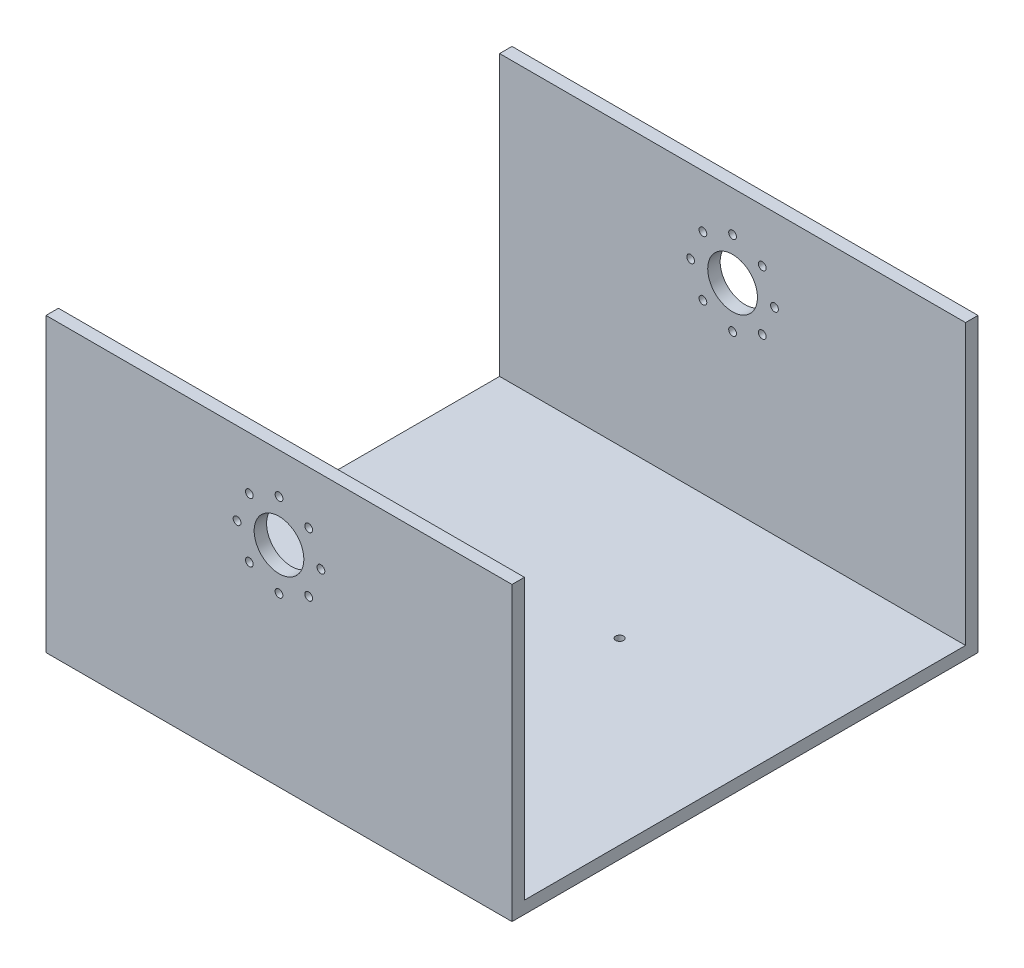
ISO-10303-21;
HEADER;
FILE_DESCRIPTION(('STEP AP214'),'2;1');
FILE_NAME('part.step','',(''),(''),'','','');
FILE_SCHEMA(('AUTOMOTIVE_DESIGN { 1 0 10303 214 1 1 1 1 }'));
ENDSEC;
DATA;
#1=APPLICATION_CONTEXT('core data for automotive mechanical design processes');
#2=APPLICATION_PROTOCOL_DEFINITION('international standard','automotive_design',2000,#1);
#3=PRODUCT_CONTEXT('',#1,'mechanical');
#4=PRODUCT('Part','Part','',(#3));
#5=PRODUCT_RELATED_PRODUCT_CATEGORY('part','',(#4));
#6=PRODUCT_DEFINITION_FORMATION('','',#4);
#7=PRODUCT_DEFINITION_CONTEXT('part definition',#1,'design');
#8=PRODUCT_DEFINITION('design','',#6,#7);
#9=PRODUCT_DEFINITION_SHAPE('','',#8);
#10=(LENGTH_UNIT() NAMED_UNIT(*) SI_UNIT(.MILLI.,.METRE.));
#11=(NAMED_UNIT(*) PLANE_ANGLE_UNIT() SI_UNIT($,.RADIAN.));
#12=(NAMED_UNIT(*) SI_UNIT($,.STERADIAN.) SOLID_ANGLE_UNIT());
#13=UNCERTAINTY_MEASURE_WITH_UNIT(LENGTH_MEASURE(1.E-05),#10,'distance_accuracy_value','');
#14=(GEOMETRIC_REPRESENTATION_CONTEXT(3) GLOBAL_UNCERTAINTY_ASSIGNED_CONTEXT((#13)) GLOBAL_UNIT_ASSIGNED_CONTEXT((#10,
#11,#12)) REPRESENTATION_CONTEXT('',''));
#15=CARTESIAN_POINT('',(0.,0.,0.));
#16=DIRECTION('',(0.,0.,1.));
#17=DIRECTION('',(1.,0.,0.));
#18=AXIS2_PLACEMENT_3D('',#15,#16,#17);
#19=CARTESIAN_POINT('',(0.,8.,0.));
#20=DIRECTION('',(0.,1.,0.));
#21=DIRECTION('',(0.,0.,1.));
#22=AXIS2_PLACEMENT_3D('',#19,#20,#21);
#23=PLANE('',#22);
#24=CARTESIAN_POINT('',(-34.6266787300674,8.,34.6266787300693));
#25=DIRECTION('',(0.,1.,0.));
#26=DIRECTION('',(0.,0.,1.));
#27=AXIS2_PLACEMENT_3D('',#24,#25,#26);
#28=CIRCLE('',#27,2.5);
#29=CARTESIAN_POINT('',(-34.6266787300674,8.,37.1266787300693));
#30=VERTEX_POINT('',#29);
#31=EDGE_CURVE('E189',#30,#30,#28,.T.);
#32=ORIENTED_EDGE('',*,*,#31,.F.);
#33=EDGE_LOOP('',(#32));
#34=FACE_BOUND('',#33,.T.);
#35=CARTESIAN_POINT('',(34.6266787300712,8.,34.6266787300674));
#36=DIRECTION('',(0.,1.,0.));
#37=DIRECTION('',(0.,0.,1.));
#38=AXIS2_PLACEMENT_3D('',#35,#36,#37);
#39=CIRCLE('',#38,2.5);
#40=CARTESIAN_POINT('',(34.6266787300712,8.,37.1266787300674));
#41=VERTEX_POINT('',#40);
#42=EDGE_CURVE('E199',#41,#41,#39,.T.);
#43=ORIENTED_EDGE('',*,*,#42,.F.);
#44=EDGE_LOOP('',(#43));
#45=FACE_BOUND('',#44,.T.);
#46=CARTESIAN_POINT('',(34.6266787300693,8.,-34.6266787300712));
#47=DIRECTION('',(0.,1.,0.));
#48=DIRECTION('',(0.,0.,1.));
#49=AXIS2_PLACEMENT_3D('',#46,#47,#48);
#50=CIRCLE('',#49,2.5);
#51=CARTESIAN_POINT('',(34.6266787300693,8.,-32.1266787300712));
#52=VERTEX_POINT('',#51);
#53=EDGE_CURVE('E195',#52,#52,#50,.T.);
#54=ORIENTED_EDGE('',*,*,#53,.F.);
#55=EDGE_LOOP('',(#54));
#56=FACE_BOUND('',#55,.T.);
#57=CARTESIAN_POINT('',(-34.6266787300693,8.,-34.6266787300693));
#58=DIRECTION('',(0.,1.,0.));
#59=DIRECTION('',(0.,0.,1.));
#60=AXIS2_PLACEMENT_3D('',#57,#58,#59);
#61=CIRCLE('',#60,2.5);
#62=CARTESIAN_POINT('',(-34.6266787300693,8.,-32.1266787300693));
#63=VERTEX_POINT('',#62);
#64=EDGE_CURVE('E190',#63,#63,#61,.T.);
#65=ORIENTED_EDGE('',*,*,#64,.F.);
#66=EDGE_LOOP('',(#65));
#67=FACE_BOUND('',#66,.T.);
#68=CARTESIAN_POINT('',(0.,8.,0.));
#69=DIRECTION('',(0.,1.,0.));
#70=DIRECTION('',(0.,0.,1.));
#71=AXIS2_PLACEMENT_3D('',#68,#69,#70);
#72=CIRCLE('',#71,5.);
#73=CARTESIAN_POINT('',(0.,8.,5.));
#74=VERTEX_POINT('',#73);
#75=EDGE_CURVE('E194',#74,#74,#72,.T.);
#76=ORIENTED_EDGE('',*,*,#75,.F.);
#77=EDGE_LOOP('',(#76));
#78=FACE_BOUND('',#77,.T.);
#79=DIRECTION('',(0.,0.,1.));
#80=VECTOR('',#79,1.);
#81=CARTESIAN_POINT('',(-150.,8.,-150.));
#82=LINE('',#81,#80);
#83=CARTESIAN_POINT('',(-150.,8.,-142.));
#84=VERTEX_POINT('',#83);
#85=CARTESIAN_POINT('',(-150.,8.,142.));
#86=VERTEX_POINT('',#85);
#87=EDGE_CURVE('E213',#84,#86,#82,.T.);
#88=ORIENTED_EDGE('',*,*,#87,.T.);
#89=DIRECTION('',(-1.,0.,0.));
#90=VECTOR('',#89,1.);
#91=CARTESIAN_POINT('',(-150.,8.,142.));
#92=LINE('',#91,#90);
#93=CARTESIAN_POINT('',(150.,8.,142.));
#94=VERTEX_POINT('',#93);
#95=EDGE_CURVE('E144',#94,#86,#92,.T.);
#96=ORIENTED_EDGE('',*,*,#95,.F.);
#97=DIRECTION('',(0.,0.,-1.));
#98=VECTOR('',#97,1.);
#99=CARTESIAN_POINT('',(150.,8.,-150.));
#100=LINE('',#99,#98);
#101=CARTESIAN_POINT('',(150.,8.,-142.));
#102=VERTEX_POINT('',#101);
#103=EDGE_CURVE('E210',#94,#102,#100,.T.);
#104=ORIENTED_EDGE('',*,*,#103,.T.);
#105=DIRECTION('',(1.,0.,0.));
#106=VECTOR('',#105,1.);
#107=CARTESIAN_POINT('',(-150.,8.,-142.));
#108=LINE('',#107,#106);
#109=EDGE_CURVE('E73',#84,#102,#108,.T.);
#110=ORIENTED_EDGE('',*,*,#109,.F.);
#111=EDGE_LOOP('',(#88,#96,#104,#110));
#112=FACE_BOUND('',#111,.T.);
#113=ADVANCED_FACE('F47',(#34,#45,#56,#67,#78,#112),#23,.T.);
#114=CARTESIAN_POINT('',(150.,8.,-150.));
#115=DIRECTION('',(-1.,0.,0.));
#116=DIRECTION('',(0.,0.,1.));
#117=AXIS2_PLACEMENT_3D('',#114,#115,#116);
#118=PLANE('',#117);
#119=DIRECTION('',(0.,0.,-1.));
#120=VECTOR('',#119,1.);
#121=CARTESIAN_POINT('',(150.,0.,-150.));
#122=LINE('',#121,#120);
#123=CARTESIAN_POINT('',(150.,0.,150.));
#124=VERTEX_POINT('',#123);
#125=CARTESIAN_POINT('',(150.,0.,-150.));
#126=VERTEX_POINT('',#125);
#127=EDGE_CURVE('E217',#124,#126,#122,.T.);
#128=ORIENTED_EDGE('',*,*,#127,.T.);
#129=DIRECTION('',(0.,-1.,0.));
#130=VECTOR('',#129,1.);
#131=CARTESIAN_POINT('',(150.,8.,-150.));
#132=LINE('',#131,#130);
#133=CARTESIAN_POINT('',(150.,188.,-150.));
#134=VERTEX_POINT('',#133);
#135=EDGE_CURVE('E11',#134,#126,#132,.T.);
#136=ORIENTED_EDGE('',*,*,#135,.F.);
#137=DIRECTION('',(0.,0.,-1.));
#138=VECTOR('',#137,1.);
#139=CARTESIAN_POINT('',(150.,188.,-150.));
#140=LINE('',#139,#138);
#141=CARTESIAN_POINT('',(150.,188.,-142.));
#142=VERTEX_POINT('',#141);
#143=EDGE_CURVE('E171',#142,#134,#140,.T.);
#144=ORIENTED_EDGE('',*,*,#143,.F.);
#145=DIRECTION('',(0.,-1.,0.));
#146=VECTOR('',#145,1.);
#147=CARTESIAN_POINT('',(150.,188.,-142.));
#148=LINE('',#147,#146);
#149=EDGE_CURVE('E179',#142,#102,#148,.T.);
#150=ORIENTED_EDGE('',*,*,#149,.T.);
#151=ORIENTED_EDGE('',*,*,#103,.F.);
#152=DIRECTION('',(0.,-1.,0.));
#153=VECTOR('',#152,1.);
#154=CARTESIAN_POINT('',(150.,188.,142.));
#155=LINE('',#154,#153);
#156=CARTESIAN_POINT('',(150.,188.,142.));
#157=VERTEX_POINT('',#156);
#158=EDGE_CURVE('E65',#157,#94,#155,.T.);
#159=ORIENTED_EDGE('',*,*,#158,.F.);
#160=DIRECTION('',(0.,0.,-1.));
#161=VECTOR('',#160,1.);
#162=CARTESIAN_POINT('',(150.,188.,150.));
#163=LINE('',#162,#161);
#164=CARTESIAN_POINT('',(150.,188.,150.));
#165=VERTEX_POINT('',#164);
#166=EDGE_CURVE('E138',#165,#157,#163,.T.);
#167=ORIENTED_EDGE('',*,*,#166,.F.);
#168=DIRECTION('',(0.,-1.,0.));
#169=VECTOR('',#168,1.);
#170=CARTESIAN_POINT('',(150.,8.,150.));
#171=LINE('',#170,#169);
#172=EDGE_CURVE('E129',#165,#124,#171,.T.);
#173=ORIENTED_EDGE('',*,*,#172,.T.);
#174=EDGE_LOOP('',(#128,#136,#144,#150,#151,#159,#167,#173));
#175=FACE_BOUND('',#174,.T.);
#176=ADVANCED_FACE('F49',(#175),#118,.F.);
#177=CARTESIAN_POINT('',(-150.,8.,-150.));
#178=DIRECTION('',(0.,0.,1.));
#179=DIRECTION('',(1.,0.,0.));
#180=AXIS2_PLACEMENT_3D('',#177,#178,#179);
#181=PLANE('',#180);
#182=CARTESIAN_POINT('',(0.,162.,-150.));
#183=DIRECTION('',(0.,0.,1.));
#184=DIRECTION('',(1.,0.,0.));
#185=AXIS2_PLACEMENT_3D('',#182,#183,#184);
#186=CIRCLE('',#185,2.5);
#187=CARTESIAN_POINT('',(2.5,162.,-150.));
#188=VERTEX_POINT('',#187);
#189=EDGE_CURVE('E325',#188,#188,#186,.T.);
#190=ORIENTED_EDGE('',*,*,#189,.T.);
#191=EDGE_LOOP('',(#190));
#192=FACE_BOUND('',#191,.T.);
#193=CARTESIAN_POINT('',(19.0918830920369,154.091883092037,-150.));
#194=DIRECTION('',(0.,0.,1.));
#195=DIRECTION('',(1.,0.,0.));
#196=AXIS2_PLACEMENT_3D('',#193,#194,#195);
#197=CIRCLE('',#196,2.50000000000001);
#198=CARTESIAN_POINT('',(21.5918830920369,154.091883092037,-150.));
#199=VERTEX_POINT('',#198);
#200=EDGE_CURVE('E303',#199,#199,#197,.T.);
#201=ORIENTED_EDGE('',*,*,#200,.T.);
#202=EDGE_LOOP('',(#201));
#203=FACE_BOUND('',#202,.T.);
#204=CARTESIAN_POINT('',(27.0000000000004,135.,-150.));
#205=DIRECTION('',(0.,0.,1.));
#206=DIRECTION('',(1.,0.,0.));
#207=AXIS2_PLACEMENT_3D('',#204,#205,#206);
#208=CIRCLE('',#207,2.50000000000002);
#209=CARTESIAN_POINT('',(29.5000000000004,135.,-150.));
#210=VERTEX_POINT('',#209);
#211=EDGE_CURVE('E296',#210,#210,#208,.T.);
#212=ORIENTED_EDGE('',*,*,#211,.T.);
#213=EDGE_LOOP('',(#212));
#214=FACE_BOUND('',#213,.T.);
#215=CARTESIAN_POINT('',(19.0918830920373,115.908116907963,-150.));
#216=DIRECTION('',(0.,0.,1.));
#217=DIRECTION('',(1.,0.,0.));
#218=AXIS2_PLACEMENT_3D('',#215,#216,#217);
#219=CIRCLE('',#218,2.5);
#220=CARTESIAN_POINT('',(21.5918830920373,115.908116907963,-150.));
#221=VERTEX_POINT('',#220);
#222=EDGE_CURVE('E291',#221,#221,#219,.T.);
#223=ORIENTED_EDGE('',*,*,#222,.T.);
#224=EDGE_LOOP('',(#223));
#225=FACE_BOUND('',#224,.T.);
#226=CARTESIAN_POINT('',(5.65619976892587E-13,108.,-150.));
#227=DIRECTION('',(0.,0.,1.));
#228=DIRECTION('',(1.,0.,0.));
#229=AXIS2_PLACEMENT_3D('',#226,#227,#228);
#230=CIRCLE('',#229,2.5);
#231=CARTESIAN_POINT('',(2.50000000000056,108.,-150.));
#232=VERTEX_POINT('',#231);
#233=EDGE_CURVE('E286',#232,#232,#230,.T.);
#234=ORIENTED_EDGE('',*,*,#233,.T.);
#235=EDGE_LOOP('',(#234));
#236=FACE_BOUND('',#235,.T.);
#237=CARTESIAN_POINT('',(-19.0918830920363,115.908116907963,-150.));
#238=DIRECTION('',(0.,0.,1.));
#239=DIRECTION('',(1.,0.,0.));
#240=AXIS2_PLACEMENT_3D('',#237,#238,#239);
#241=CIRCLE('',#240,2.5);
#242=CARTESIAN_POINT('',(-16.5918830920363,115.908116907963,-150.));
#243=VERTEX_POINT('',#242);
#244=EDGE_CURVE('E280',#243,#243,#241,.T.);
#245=ORIENTED_EDGE('',*,*,#244,.T.);
#246=EDGE_LOOP('',(#245));
#247=FACE_BOUND('',#246,.T.);
#248=CARTESIAN_POINT('',(-26.9999999999996,135.,-150.));
#249=DIRECTION('',(0.,0.,1.));
#250=DIRECTION('',(1.,0.,0.));
#251=AXIS2_PLACEMENT_3D('',#248,#249,#250);
#252=CIRCLE('',#251,2.50000000000001);
#253=CARTESIAN_POINT('',(-24.4999999999996,135.,-150.));
#254=VERTEX_POINT('',#253);
#255=EDGE_CURVE('E274',#254,#254,#252,.T.);
#256=ORIENTED_EDGE('',*,*,#255,.T.);
#257=EDGE_LOOP('',(#256));
#258=FACE_BOUND('',#257,.T.);
#259=CARTESIAN_POINT('',(-19.0918830920365,154.091883092037,-150.));
#260=DIRECTION('',(0.,0.,1.));
#261=DIRECTION('',(1.,0.,0.));
#262=AXIS2_PLACEMENT_3D('',#259,#260,#261);
#263=CIRCLE('',#262,2.50000000000002);
#264=CARTESIAN_POINT('',(-16.5918830920364,154.091883092037,-150.));
#265=VERTEX_POINT('',#264);
#266=EDGE_CURVE('E268',#265,#265,#263,.T.);
#267=ORIENTED_EDGE('',*,*,#266,.T.);
#268=EDGE_LOOP('',(#267));
#269=FACE_BOUND('',#268,.T.);
#270=CARTESIAN_POINT('',(0.,135.,-150.));
#271=DIRECTION('',(0.,0.,1.));
#272=DIRECTION('',(1.,0.,0.));
#273=AXIS2_PLACEMENT_3D('',#270,#271,#272);
#274=CIRCLE('',#273,16.);
#275=CARTESIAN_POINT('',(16.,135.,-150.));
#276=VERTEX_POINT('',#275);
#277=EDGE_CURVE('E150',#276,#276,#274,.T.);
#278=ORIENTED_EDGE('',*,*,#277,.T.);
#279=EDGE_LOOP('',(#278));
#280=FACE_BOUND('',#279,.T.);
#281=DIRECTION('',(-1.,0.,0.));
#282=VECTOR('',#281,1.);
#283=CARTESIAN_POINT('',(-150.,0.,-150.));
#284=LINE('',#283,#282);
#285=CARTESIAN_POINT('',(-150.,0.,-150.));
#286=VERTEX_POINT('',#285);
#287=EDGE_CURVE('E221',#126,#286,#284,.T.);
#288=ORIENTED_EDGE('',*,*,#287,.T.);
#289=DIRECTION('',(0.,-1.,0.));
#290=VECTOR('',#289,1.);
#291=CARTESIAN_POINT('',(-150.,8.,-150.));
#292=LINE('',#291,#290);
#293=CARTESIAN_POINT('',(-150.,188.,-150.));
#294=VERTEX_POINT('',#293);
#295=EDGE_CURVE('E57',#294,#286,#292,.T.);
#296=ORIENTED_EDGE('',*,*,#295,.F.);
#297=DIRECTION('',(-1.,0.,0.));
#298=VECTOR('',#297,1.);
#299=CARTESIAN_POINT('',(-150.,188.,-150.));
#300=LINE('',#299,#298);
#301=EDGE_CURVE('E175',#134,#294,#300,.T.);
#302=ORIENTED_EDGE('',*,*,#301,.F.);
#303=ORIENTED_EDGE('',*,*,#135,.T.);
#304=EDGE_LOOP('',(#288,#296,#302,#303));
#305=FACE_BOUND('',#304,.T.);
#306=ADVANCED_FACE('F341',(#192,#203,#214,#225,#236,#247,#258,#269,#280,#305),#181,.F.);
#307=CARTESIAN_POINT('',(-150.,8.,-150.));
#308=DIRECTION('',(1.,0.,0.));
#309=DIRECTION('',(0.,0.,-1.));
#310=AXIS2_PLACEMENT_3D('',#307,#308,#309);
#311=PLANE('',#310);
#312=DIRECTION('',(0.,0.,1.));
#313=VECTOR('',#312,1.);
#314=CARTESIAN_POINT('',(-150.,0.,-150.));
#315=LINE('',#314,#313);
#316=CARTESIAN_POINT('',(-150.,0.,150.));
#317=VERTEX_POINT('',#316);
#318=EDGE_CURVE('E125',#286,#317,#315,.T.);
#319=ORIENTED_EDGE('',*,*,#318,.T.);
#320=DIRECTION('',(0.,-1.,0.));
#321=VECTOR('',#320,1.);
#322=CARTESIAN_POINT('',(-150.,8.,150.));
#323=LINE('',#322,#321);
#324=CARTESIAN_POINT('',(-150.,188.,150.));
#325=VERTEX_POINT('',#324);
#326=EDGE_CURVE('E117',#325,#317,#323,.T.);
#327=ORIENTED_EDGE('',*,*,#326,.F.);
#328=DIRECTION('',(0.,0.,1.));
#329=VECTOR('',#328,1.);
#330=CARTESIAN_POINT('',(-150.,188.,150.));
#331=LINE('',#330,#329);
#332=CARTESIAN_POINT('',(-150.,188.,142.));
#333=VERTEX_POINT('',#332);
#334=EDGE_CURVE('E122',#333,#325,#331,.T.);
#335=ORIENTED_EDGE('',*,*,#334,.F.);
#336=DIRECTION('',(0.,-1.,0.));
#337=VECTOR('',#336,1.);
#338=CARTESIAN_POINT('',(-150.,188.,142.));
#339=LINE('',#338,#337);
#340=EDGE_CURVE('E158',#333,#86,#339,.T.);
#341=ORIENTED_EDGE('',*,*,#340,.T.);
#342=ORIENTED_EDGE('',*,*,#87,.F.);
#343=DIRECTION('',(0.,-1.,0.));
#344=VECTOR('',#343,1.);
#345=CARTESIAN_POINT('',(-150.,188.,-142.));
#346=LINE('',#345,#344);
#347=CARTESIAN_POINT('',(-150.,188.,-142.));
#348=VERTEX_POINT('',#347);
#349=EDGE_CURVE('E185',#348,#84,#346,.T.);
#350=ORIENTED_EDGE('',*,*,#349,.F.);
#351=DIRECTION('',(0.,0.,1.));
#352=VECTOR('',#351,1.);
#353=CARTESIAN_POINT('',(-150.,188.,-150.));
#354=LINE('',#353,#352);
#355=EDGE_CURVE('E164',#294,#348,#354,.T.);
#356=ORIENTED_EDGE('',*,*,#355,.F.);
#357=ORIENTED_EDGE('',*,*,#295,.T.);
#358=EDGE_LOOP('',(#319,#327,#335,#341,#342,#350,#356,#357));
#359=FACE_BOUND('',#358,.T.);
#360=ADVANCED_FACE('F119',(#359),#311,.F.);
#361=CARTESIAN_POINT('',(-150.,8.,150.));
#362=DIRECTION('',(0.,0.,-1.));
#363=DIRECTION('',(-1.,0.,0.));
#364=AXIS2_PLACEMENT_3D('',#361,#362,#363);
#365=PLANE('',#364);
#366=CARTESIAN_POINT('',(0.,162.,150.));
#367=DIRECTION('',(0.,0.,1.));
#368=DIRECTION('',(1.,0.,0.));
#369=AXIS2_PLACEMENT_3D('',#366,#367,#368);
#370=CIRCLE('',#369,2.5);
#371=CARTESIAN_POINT('',(2.5,162.,150.));
#372=VERTEX_POINT('',#371);
#373=EDGE_CURVE('E262',#372,#372,#370,.T.);
#374=ORIENTED_EDGE('',*,*,#373,.F.);
#375=EDGE_LOOP('',(#374));
#376=FACE_BOUND('',#375,.T.);
#377=CARTESIAN_POINT('',(19.0918830920369,154.091883092037,150.));
#378=DIRECTION('',(0.,0.,1.));
#379=DIRECTION('',(1.,0.,0.));
#380=AXIS2_PLACEMENT_3D('',#377,#378,#379);
#381=CIRCLE('',#380,2.50000000000001);
#382=CARTESIAN_POINT('',(21.5918830920369,154.091883092037,150.));
#383=VERTEX_POINT('',#382);
#384=EDGE_CURVE('E489',#383,#383,#381,.T.);
#385=ORIENTED_EDGE('',*,*,#384,.F.);
#386=EDGE_LOOP('',(#385));
#387=FACE_BOUND('',#386,.T.);
#388=CARTESIAN_POINT('',(27.0000000000004,135.,150.));
#389=DIRECTION('',(0.,0.,1.));
#390=DIRECTION('',(1.,0.,0.));
#391=AXIS2_PLACEMENT_3D('',#388,#389,#390);
#392=CIRCLE('',#391,2.50000000000002);
#393=CARTESIAN_POINT('',(29.5000000000004,135.,150.));
#394=VERTEX_POINT('',#393);
#395=EDGE_CURVE('E462',#394,#394,#392,.T.);
#396=ORIENTED_EDGE('',*,*,#395,.F.);
#397=EDGE_LOOP('',(#396));
#398=FACE_BOUND('',#397,.T.);
#399=CARTESIAN_POINT('',(19.0918830920373,115.908116907963,150.));
#400=DIRECTION('',(0.,0.,1.));
#401=DIRECTION('',(1.,0.,0.));
#402=AXIS2_PLACEMENT_3D('',#399,#400,#401);
#403=CIRCLE('',#402,2.5);
#404=CARTESIAN_POINT('',(21.5918830920373,115.908116907963,150.));
#405=VERTEX_POINT('',#404);
#406=EDGE_CURVE('E459',#405,#405,#403,.T.);
#407=ORIENTED_EDGE('',*,*,#406,.F.);
#408=EDGE_LOOP('',(#407));
#409=FACE_BOUND('',#408,.T.);
#410=CARTESIAN_POINT('',(5.65619976892587E-13,108.,150.));
#411=DIRECTION('',(0.,0.,1.));
#412=DIRECTION('',(1.,0.,0.));
#413=AXIS2_PLACEMENT_3D('',#410,#411,#412);
#414=CIRCLE('',#413,2.5);
#415=CARTESIAN_POINT('',(2.50000000000056,108.,150.));
#416=VERTEX_POINT('',#415);
#417=EDGE_CURVE('E463',#416,#416,#414,.T.);
#418=ORIENTED_EDGE('',*,*,#417,.F.);
#419=EDGE_LOOP('',(#418));
#420=FACE_BOUND('',#419,.T.);
#421=CARTESIAN_POINT('',(-19.0918830920363,115.908116907963,150.));
#422=DIRECTION('',(0.,0.,1.));
#423=DIRECTION('',(1.,0.,0.));
#424=AXIS2_PLACEMENT_3D('',#421,#422,#423);
#425=CIRCLE('',#424,2.5);
#426=CARTESIAN_POINT('',(-16.5918830920363,115.908116907963,150.));
#427=VERTEX_POINT('',#426);
#428=EDGE_CURVE('E472',#427,#427,#425,.T.);
#429=ORIENTED_EDGE('',*,*,#428,.F.);
#430=EDGE_LOOP('',(#429));
#431=FACE_BOUND('',#430,.T.);
#432=CARTESIAN_POINT('',(-26.9999999999996,135.,150.));
#433=DIRECTION('',(0.,0.,1.));
#434=DIRECTION('',(1.,0.,0.));
#435=AXIS2_PLACEMENT_3D('',#432,#433,#434);
#436=CIRCLE('',#435,2.50000000000001);
#437=CARTESIAN_POINT('',(-24.4999999999996,135.,150.));
#438=VERTEX_POINT('',#437);
#439=EDGE_CURVE('E477',#438,#438,#436,.T.);
#440=ORIENTED_EDGE('',*,*,#439,.F.);
#441=EDGE_LOOP('',(#440));
#442=FACE_BOUND('',#441,.T.);
#443=CARTESIAN_POINT('',(-19.0918830920365,154.091883092037,150.));
#444=DIRECTION('',(0.,0.,1.));
#445=DIRECTION('',(1.,0.,0.));
#446=AXIS2_PLACEMENT_3D('',#443,#444,#445);
#447=CIRCLE('',#446,2.50000000000002);
#448=CARTESIAN_POINT('',(-16.5918830920364,154.091883092037,150.));
#449=VERTEX_POINT('',#448);
#450=EDGE_CURVE('E482',#449,#449,#447,.T.);
#451=ORIENTED_EDGE('',*,*,#450,.F.);
#452=EDGE_LOOP('',(#451));
#453=FACE_BOUND('',#452,.T.);
#454=CARTESIAN_POINT('',(0.,135.,150.));
#455=DIRECTION('',(0.,0.,1.));
#456=DIRECTION('',(1.,0.,0.));
#457=AXIS2_PLACEMENT_3D('',#454,#455,#456);
#458=CIRCLE('',#457,16.);
#459=CARTESIAN_POINT('',(16.,135.,150.));
#460=VERTEX_POINT('',#459);
#461=EDGE_CURVE('E256',#460,#460,#458,.T.);
#462=ORIENTED_EDGE('',*,*,#461,.F.);
#463=EDGE_LOOP('',(#462));
#464=FACE_BOUND('',#463,.T.);
#465=DIRECTION('',(1.,0.,0.));
#466=VECTOR('',#465,1.);
#467=CARTESIAN_POINT('',(-150.,0.,150.));
#468=LINE('',#467,#466);
#469=EDGE_CURVE('E214',#317,#124,#468,.T.);
#470=ORIENTED_EDGE('',*,*,#469,.T.);
#471=ORIENTED_EDGE('',*,*,#172,.F.);
#472=DIRECTION('',(1.,0.,0.));
#473=VECTOR('',#472,1.);
#474=CARTESIAN_POINT('',(-150.,188.,150.));
#475=LINE('',#474,#473);
#476=EDGE_CURVE('E132',#325,#165,#475,.T.);
#477=ORIENTED_EDGE('',*,*,#476,.F.);
#478=ORIENTED_EDGE('',*,*,#326,.T.);
#479=EDGE_LOOP('',(#470,#471,#477,#478));
#480=FACE_BOUND('',#479,.T.);
#481=ADVANCED_FACE('F133',(#376,#387,#398,#409,#420,#431,#442,#453,#464,#480),#365,.F.);
#482=CARTESIAN_POINT('',(0.,0.,0.));
#483=DIRECTION('',(0.,1.,0.));
#484=DIRECTION('',(0.,0.,1.));
#485=AXIS2_PLACEMENT_3D('',#482,#483,#484);
#486=PLANE('',#485);
#487=CARTESIAN_POINT('',(-34.6266787300674,0.,34.6266787300693));
#488=DIRECTION('',(0.,1.,0.));
#489=DIRECTION('',(0.,0.,1.));
#490=AXIS2_PLACEMENT_3D('',#487,#488,#489);
#491=CIRCLE('',#490,2.5);
#492=CARTESIAN_POINT('',(-34.6266787300674,0.,37.1266787300693));
#493=VERTEX_POINT('',#492);
#494=EDGE_CURVE('E222',#493,#493,#491,.T.);
#495=ORIENTED_EDGE('',*,*,#494,.T.);
#496=EDGE_LOOP('',(#495));
#497=FACE_BOUND('',#496,.T.);
#498=CARTESIAN_POINT('',(34.6266787300712,0.,34.6266787300674));
#499=DIRECTION('',(0.,1.,0.));
#500=DIRECTION('',(0.,0.,1.));
#501=AXIS2_PLACEMENT_3D('',#498,#499,#500);
#502=CIRCLE('',#501,2.5);
#503=CARTESIAN_POINT('',(34.6266787300712,0.,37.1266787300674));
#504=VERTEX_POINT('',#503);
#505=EDGE_CURVE('E244',#504,#504,#502,.T.);
#506=ORIENTED_EDGE('',*,*,#505,.T.);
#507=EDGE_LOOP('',(#506));
#508=FACE_BOUND('',#507,.T.);
#509=CARTESIAN_POINT('',(34.6266787300693,0.,-34.6266787300712));
#510=DIRECTION('',(0.,1.,0.));
#511=DIRECTION('',(0.,0.,1.));
#512=AXIS2_PLACEMENT_3D('',#509,#510,#511);
#513=CIRCLE('',#512,2.5);
#514=CARTESIAN_POINT('',(34.6266787300693,0.,-32.1266787300712));
#515=VERTEX_POINT('',#514);
#516=EDGE_CURVE('E240',#515,#515,#513,.T.);
#517=ORIENTED_EDGE('',*,*,#516,.T.);
#518=EDGE_LOOP('',(#517));
#519=FACE_BOUND('',#518,.T.);
#520=CARTESIAN_POINT('',(-34.6266787300693,0.,-34.6266787300693));
#521=DIRECTION('',(0.,1.,0.));
#522=DIRECTION('',(0.,0.,1.));
#523=AXIS2_PLACEMENT_3D('',#520,#521,#522);
#524=CIRCLE('',#523,2.5);
#525=CARTESIAN_POINT('',(-34.6266787300693,0.,-32.1266787300693));
#526=VERTEX_POINT('',#525);
#527=EDGE_CURVE('E236',#526,#526,#524,.T.);
#528=ORIENTED_EDGE('',*,*,#527,.T.);
#529=EDGE_LOOP('',(#528));
#530=FACE_BOUND('',#529,.T.);
#531=CARTESIAN_POINT('',(0.,0.,0.));
#532=DIRECTION('',(0.,1.,0.));
#533=DIRECTION('',(0.,0.,1.));
#534=AXIS2_PLACEMENT_3D('',#531,#532,#533);
#535=CIRCLE('',#534,5.);
#536=CARTESIAN_POINT('',(0.,0.,5.));
#537=VERTEX_POINT('',#536);
#538=EDGE_CURVE('E209',#537,#537,#535,.T.);
#539=ORIENTED_EDGE('',*,*,#538,.T.);
#540=EDGE_LOOP('',(#539));
#541=FACE_BOUND('',#540,.T.);
#542=ORIENTED_EDGE('',*,*,#127,.F.);
#543=ORIENTED_EDGE('',*,*,#469,.F.);
#544=ORIENTED_EDGE('',*,*,#318,.F.);
#545=ORIENTED_EDGE('',*,*,#287,.F.);
#546=EDGE_LOOP('',(#542,#543,#544,#545));
#547=FACE_BOUND('',#546,.T.);
#548=ADVANCED_FACE('F371',(#497,#508,#519,#530,#541,#547),#486,.F.);
#549=CARTESIAN_POINT('',(0.,-8.,0.));
#550=DIRECTION('',(0.,1.,0.));
#551=DIRECTION('',(0.,0.,1.));
#552=AXIS2_PLACEMENT_3D('',#549,#550,#551);
#553=CYLINDRICAL_SURFACE('',#552,5.);
#554=ORIENTED_EDGE('',*,*,#75,.T.);
#555=EDGE_LOOP('',(#554));
#556=FACE_BOUND('',#555,.T.);
#557=ORIENTED_EDGE('',*,*,#538,.F.);
#558=EDGE_LOOP('',(#557));
#559=FACE_BOUND('',#558,.T.);
#560=ADVANCED_FACE('F369',(#556,#559),#553,.F.);
#561=CARTESIAN_POINT('',(-34.6266787300693,-8.,-34.6266787300693));
#562=DIRECTION('',(0.,1.,0.));
#563=DIRECTION('',(0.,0.,1.));
#564=AXIS2_PLACEMENT_3D('',#561,#562,#563);
#565=CYLINDRICAL_SURFACE('',#564,2.5);
#566=ORIENTED_EDGE('',*,*,#64,.T.);
#567=EDGE_LOOP('',(#566));
#568=FACE_BOUND('',#567,.T.);
#569=ORIENTED_EDGE('',*,*,#527,.F.);
#570=EDGE_LOOP('',(#569));
#571=FACE_BOUND('',#570,.T.);
#572=ADVANCED_FACE('F539',(#568,#571),#565,.F.);
#573=CARTESIAN_POINT('',(34.6266787300693,-8.,-34.6266787300712));
#574=DIRECTION('',(0.,1.,0.));
#575=DIRECTION('',(0.,0.,1.));
#576=AXIS2_PLACEMENT_3D('',#573,#574,#575);
#577=CYLINDRICAL_SURFACE('',#576,2.5);
#578=ORIENTED_EDGE('',*,*,#53,.T.);
#579=EDGE_LOOP('',(#578));
#580=FACE_BOUND('',#579,.T.);
#581=ORIENTED_EDGE('',*,*,#516,.F.);
#582=EDGE_LOOP('',(#581));
#583=FACE_BOUND('',#582,.T.);
#584=ADVANCED_FACE('F542',(#580,#583),#577,.F.);
#585=CARTESIAN_POINT('',(34.6266787300712,-8.,34.6266787300674));
#586=DIRECTION('',(0.,1.,0.));
#587=DIRECTION('',(0.,0.,1.));
#588=AXIS2_PLACEMENT_3D('',#585,#586,#587);
#589=CYLINDRICAL_SURFACE('',#588,2.5);
#590=ORIENTED_EDGE('',*,*,#42,.T.);
#591=EDGE_LOOP('',(#590));
#592=FACE_BOUND('',#591,.T.);
#593=ORIENTED_EDGE('',*,*,#505,.F.);
#594=EDGE_LOOP('',(#593));
#595=FACE_BOUND('',#594,.T.);
#596=ADVANCED_FACE('F546',(#592,#595),#589,.F.);
#597=CARTESIAN_POINT('',(-34.6266787300674,-8.,34.6266787300693));
#598=DIRECTION('',(0.,1.,0.));
#599=DIRECTION('',(0.,0.,1.));
#600=AXIS2_PLACEMENT_3D('',#597,#598,#599);
#601=CYLINDRICAL_SURFACE('',#600,2.5);
#602=ORIENTED_EDGE('',*,*,#31,.T.);
#603=EDGE_LOOP('',(#602));
#604=FACE_BOUND('',#603,.T.);
#605=ORIENTED_EDGE('',*,*,#494,.F.);
#606=EDGE_LOOP('',(#605));
#607=FACE_BOUND('',#606,.T.);
#608=ADVANCED_FACE('F535',(#604,#607),#601,.F.);
#609=CARTESIAN_POINT('',(-150.,188.,-142.));
#610=DIRECTION('',(0.,0.,-1.));
#611=DIRECTION('',(-1.,0.,0.));
#612=AXIS2_PLACEMENT_3D('',#609,#610,#611);
#613=PLANE('',#612);
#614=CARTESIAN_POINT('',(0.,162.,-142.));
#615=DIRECTION('',(0.,0.,-1.));
#616=DIRECTION('',(-1.,0.,0.));
#617=AXIS2_PLACEMENT_3D('',#614,#615,#616);
#618=CIRCLE('',#617,2.5);
#619=CARTESIAN_POINT('',(-2.5,162.,-142.));
#620=VERTEX_POINT('',#619);
#621=EDGE_CURVE('E321',#620,#620,#618,.T.);
#622=ORIENTED_EDGE('',*,*,#621,.T.);
#623=EDGE_LOOP('',(#622));
#624=FACE_BOUND('',#623,.T.);
#625=CARTESIAN_POINT('',(19.0918830920369,154.091883092037,-142.));
#626=DIRECTION('',(0.,0.,-1.));
#627=DIRECTION('',(-1.,0.,0.));
#628=AXIS2_PLACEMENT_3D('',#625,#626,#627);
#629=CIRCLE('',#628,2.50000000000001);
#630=CARTESIAN_POINT('',(16.5918830920369,154.091883092037,-142.));
#631=VERTEX_POINT('',#630);
#632=EDGE_CURVE('E295',#631,#631,#629,.T.);
#633=ORIENTED_EDGE('',*,*,#632,.T.);
#634=EDGE_LOOP('',(#633));
#635=FACE_BOUND('',#634,.T.);
#636=CARTESIAN_POINT('',(27.0000000000004,135.,-142.));
#637=DIRECTION('',(0.,0.,-1.));
#638=DIRECTION('',(-1.,0.,0.));
#639=AXIS2_PLACEMENT_3D('',#636,#637,#638);
#640=CIRCLE('',#639,2.50000000000002);
#641=CARTESIAN_POINT('',(24.5000000000004,135.,-142.));
#642=VERTEX_POINT('',#641);
#643=EDGE_CURVE('E290',#642,#642,#640,.T.);
#644=ORIENTED_EDGE('',*,*,#643,.T.);
#645=EDGE_LOOP('',(#644));
#646=FACE_BOUND('',#645,.T.);
#647=CARTESIAN_POINT('',(19.0918830920373,115.908116907963,-142.));
#648=DIRECTION('',(0.,0.,-1.));
#649=DIRECTION('',(-1.,0.,0.));
#650=AXIS2_PLACEMENT_3D('',#647,#648,#649);
#651=CIRCLE('',#650,2.5);
#652=CARTESIAN_POINT('',(16.5918830920373,115.908116907963,-142.));
#653=VERTEX_POINT('',#652);
#654=EDGE_CURVE('E285',#653,#653,#651,.T.);
#655=ORIENTED_EDGE('',*,*,#654,.T.);
#656=EDGE_LOOP('',(#655));
#657=FACE_BOUND('',#656,.T.);
#658=CARTESIAN_POINT('',(5.65619976892587E-13,108.,-142.));
#659=DIRECTION('',(0.,0.,-1.));
#660=DIRECTION('',(-1.,0.,0.));
#661=AXIS2_PLACEMENT_3D('',#658,#659,#660);
#662=CIRCLE('',#661,2.5);
#663=CARTESIAN_POINT('',(-2.49999999999943,108.,-142.));
#664=VERTEX_POINT('',#663);
#665=EDGE_CURVE('E279',#664,#664,#662,.T.);
#666=ORIENTED_EDGE('',*,*,#665,.T.);
#667=EDGE_LOOP('',(#666));
#668=FACE_BOUND('',#667,.T.);
#669=CARTESIAN_POINT('',(-19.0918830920363,115.908116907963,-142.));
#670=DIRECTION('',(0.,0.,-1.));
#671=DIRECTION('',(-1.,0.,0.));
#672=AXIS2_PLACEMENT_3D('',#669,#670,#671);
#673=CIRCLE('',#672,2.5);
#674=CARTESIAN_POINT('',(-21.5918830920363,115.908116907963,-142.));
#675=VERTEX_POINT('',#674);
#676=EDGE_CURVE('E273',#675,#675,#673,.T.);
#677=ORIENTED_EDGE('',*,*,#676,.T.);
#678=EDGE_LOOP('',(#677));
#679=FACE_BOUND('',#678,.T.);
#680=CARTESIAN_POINT('',(-26.9999999999996,135.,-142.));
#681=DIRECTION('',(0.,0.,-1.));
#682=DIRECTION('',(-1.,0.,0.));
#683=AXIS2_PLACEMENT_3D('',#680,#681,#682);
#684=CIRCLE('',#683,2.50000000000001);
#685=CARTESIAN_POINT('',(-29.4999999999996,135.,-142.));
#686=VERTEX_POINT('',#685);
#687=EDGE_CURVE('E267',#686,#686,#684,.T.);
#688=ORIENTED_EDGE('',*,*,#687,.T.);
#689=EDGE_LOOP('',(#688));
#690=FACE_BOUND('',#689,.T.);
#691=CARTESIAN_POINT('',(-19.0918830920365,154.091883092037,-142.));
#692=DIRECTION('',(0.,0.,-1.));
#693=DIRECTION('',(-1.,0.,0.));
#694=AXIS2_PLACEMENT_3D('',#691,#692,#693);
#695=CIRCLE('',#694,2.50000000000002);
#696=CARTESIAN_POINT('',(-21.5918830920365,154.091883092037,-142.));
#697=VERTEX_POINT('',#696);
#698=EDGE_CURVE('E261',#697,#697,#695,.T.);
#699=ORIENTED_EDGE('',*,*,#698,.T.);
#700=EDGE_LOOP('',(#699));
#701=FACE_BOUND('',#700,.T.);
#702=CARTESIAN_POINT('',(0.,135.,-142.));
#703=DIRECTION('',(0.,0.,-1.));
#704=DIRECTION('',(-1.,0.,0.));
#705=AXIS2_PLACEMENT_3D('',#702,#703,#704);
#706=CIRCLE('',#705,16.);
#707=CARTESIAN_POINT('',(-16.,135.,-142.));
#708=VERTEX_POINT('',#707);
#709=EDGE_CURVE('E255',#708,#708,#706,.T.);
#710=ORIENTED_EDGE('',*,*,#709,.T.);
#711=EDGE_LOOP('',(#710));
#712=FACE_BOUND('',#711,.T.);
#713=ORIENTED_EDGE('',*,*,#109,.T.);
#714=ORIENTED_EDGE('',*,*,#149,.F.);
#715=DIRECTION('',(1.,0.,0.));
#716=VECTOR('',#715,1.);
#717=CARTESIAN_POINT('',(-150.,188.,-142.));
#718=LINE('',#717,#716);
#719=EDGE_CURVE('E168',#348,#142,#718,.T.);
#720=ORIENTED_EDGE('',*,*,#719,.F.);
#721=ORIENTED_EDGE('',*,*,#349,.T.);
#722=EDGE_LOOP('',(#713,#714,#720,#721));
#723=FACE_BOUND('',#722,.T.);
#724=ADVANCED_FACE('F524',(#624,#635,#646,#657,#668,#679,#690,#701,#712,#723),#613,.F.);
#725=CARTESIAN_POINT('',(0.,188.,0.));
#726=DIRECTION('',(0.,1.,0.));
#727=DIRECTION('',(0.,0.,1.));
#728=AXIS2_PLACEMENT_3D('',#725,#726,#727);
#729=PLANE('',#728);
#730=ORIENTED_EDGE('',*,*,#355,.T.);
#731=ORIENTED_EDGE('',*,*,#719,.T.);
#732=ORIENTED_EDGE('',*,*,#143,.T.);
#733=ORIENTED_EDGE('',*,*,#301,.T.);
#734=EDGE_LOOP('',(#730,#731,#732,#733));
#735=FACE_BOUND('',#734,.T.);
#736=ADVANCED_FACE('F517',(#735),#729,.T.);
#737=CARTESIAN_POINT('',(-150.,188.,142.));
#738=DIRECTION('',(0.,0.,1.));
#739=DIRECTION('',(1.,0.,0.));
#740=AXIS2_PLACEMENT_3D('',#737,#738,#739);
#741=PLANE('',#740);
#742=CARTESIAN_POINT('',(0.,162.,142.));
#743=DIRECTION('',(0.,0.,1.));
#744=DIRECTION('',(1.,0.,0.));
#745=AXIS2_PLACEMENT_3D('',#742,#743,#744);
#746=CIRCLE('',#745,2.5);
#747=CARTESIAN_POINT('',(2.5,162.,142.));
#748=VERTEX_POINT('',#747);
#749=EDGE_CURVE('E51',#748,#748,#746,.T.);
#750=ORIENTED_EDGE('',*,*,#749,.T.);
#751=EDGE_LOOP('',(#750));
#752=FACE_BOUND('',#751,.T.);
#753=CARTESIAN_POINT('',(19.0918830920369,154.091883092037,142.));
#754=DIRECTION('',(0.,0.,1.));
#755=DIRECTION('',(1.,0.,0.));
#756=AXIS2_PLACEMENT_3D('',#753,#754,#755);
#757=CIRCLE('',#756,2.50000000000001);
#758=CARTESIAN_POINT('',(21.5918830920369,154.091883092037,142.));
#759=VERTEX_POINT('',#758);
#760=EDGE_CURVE('E292',#759,#759,#757,.T.);
#761=ORIENTED_EDGE('',*,*,#760,.T.);
#762=EDGE_LOOP('',(#761));
#763=FACE_BOUND('',#762,.T.);
#764=CARTESIAN_POINT('',(27.0000000000004,135.,142.));
#765=DIRECTION('',(0.,0.,1.));
#766=DIRECTION('',(1.,0.,0.));
#767=AXIS2_PLACEMENT_3D('',#764,#765,#766);
#768=CIRCLE('',#767,2.50000000000002);
#769=CARTESIAN_POINT('',(29.5000000000004,135.,142.));
#770=VERTEX_POINT('',#769);
#771=EDGE_CURVE('E287',#770,#770,#768,.T.);
#772=ORIENTED_EDGE('',*,*,#771,.T.);
#773=EDGE_LOOP('',(#772));
#774=FACE_BOUND('',#773,.T.);
#775=CARTESIAN_POINT('',(19.0918830920373,115.908116907963,142.));
#776=DIRECTION('',(0.,0.,1.));
#777=DIRECTION('',(1.,0.,0.));
#778=AXIS2_PLACEMENT_3D('',#775,#776,#777);
#779=CIRCLE('',#778,2.5);
#780=CARTESIAN_POINT('',(21.5918830920373,115.908116907963,142.));
#781=VERTEX_POINT('',#780);
#782=EDGE_CURVE('E281',#781,#781,#779,.T.);
#783=ORIENTED_EDGE('',*,*,#782,.T.);
#784=EDGE_LOOP('',(#783));
#785=FACE_BOUND('',#784,.T.);
#786=CARTESIAN_POINT('',(5.65619976892587E-13,108.,142.));
#787=DIRECTION('',(0.,0.,1.));
#788=DIRECTION('',(1.,0.,0.));
#789=AXIS2_PLACEMENT_3D('',#786,#787,#788);
#790=CIRCLE('',#789,2.5);
#791=CARTESIAN_POINT('',(2.50000000000056,108.,142.));
#792=VERTEX_POINT('',#791);
#793=EDGE_CURVE('E275',#792,#792,#790,.T.);
#794=ORIENTED_EDGE('',*,*,#793,.T.);
#795=EDGE_LOOP('',(#794));
#796=FACE_BOUND('',#795,.T.);
#797=CARTESIAN_POINT('',(-19.0918830920363,115.908116907963,142.));
#798=DIRECTION('',(0.,0.,1.));
#799=DIRECTION('',(1.,0.,0.));
#800=AXIS2_PLACEMENT_3D('',#797,#798,#799);
#801=CIRCLE('',#800,2.5);
#802=CARTESIAN_POINT('',(-16.5918830920363,115.908116907963,142.));
#803=VERTEX_POINT('',#802);
#804=EDGE_CURVE('E269',#803,#803,#801,.T.);
#805=ORIENTED_EDGE('',*,*,#804,.T.);
#806=EDGE_LOOP('',(#805));
#807=FACE_BOUND('',#806,.T.);
#808=CARTESIAN_POINT('',(-26.9999999999996,135.,142.));
#809=DIRECTION('',(0.,0.,1.));
#810=DIRECTION('',(1.,0.,0.));
#811=AXIS2_PLACEMENT_3D('',#808,#809,#810);
#812=CIRCLE('',#811,2.50000000000001);
#813=CARTESIAN_POINT('',(-24.4999999999996,135.,142.));
#814=VERTEX_POINT('',#813);
#815=EDGE_CURVE('E263',#814,#814,#812,.T.);
#816=ORIENTED_EDGE('',*,*,#815,.T.);
#817=EDGE_LOOP('',(#816));
#818=FACE_BOUND('',#817,.T.);
#819=CARTESIAN_POINT('',(-19.0918830920365,154.091883092037,142.));
#820=DIRECTION('',(0.,0.,1.));
#821=DIRECTION('',(1.,0.,0.));
#822=AXIS2_PLACEMENT_3D('',#819,#820,#821);
#823=CIRCLE('',#822,2.50000000000002);
#824=CARTESIAN_POINT('',(-16.5918830920364,154.091883092037,142.));
#825=VERTEX_POINT('',#824);
#826=EDGE_CURVE('E257',#825,#825,#823,.T.);
#827=ORIENTED_EDGE('',*,*,#826,.T.);
#828=EDGE_LOOP('',(#827));
#829=FACE_BOUND('',#828,.T.);
#830=CARTESIAN_POINT('',(0.,135.,142.));
#831=DIRECTION('',(0.,0.,1.));
#832=DIRECTION('',(1.,0.,0.));
#833=AXIS2_PLACEMENT_3D('',#830,#831,#832);
#834=CIRCLE('',#833,16.);
#835=CARTESIAN_POINT('',(16.,135.,142.));
#836=VERTEX_POINT('',#835);
#837=EDGE_CURVE('E251',#836,#836,#834,.T.);
#838=ORIENTED_EDGE('',*,*,#837,.T.);
#839=EDGE_LOOP('',(#838));
#840=FACE_BOUND('',#839,.T.);
#841=ORIENTED_EDGE('',*,*,#95,.T.);
#842=ORIENTED_EDGE('',*,*,#340,.F.);
#843=DIRECTION('',(-1.,0.,0.));
#844=VECTOR('',#843,1.);
#845=CARTESIAN_POINT('',(-150.,188.,142.));
#846=LINE('',#845,#844);
#847=EDGE_CURVE('E141',#157,#333,#846,.T.);
#848=ORIENTED_EDGE('',*,*,#847,.F.);
#849=ORIENTED_EDGE('',*,*,#158,.T.);
#850=EDGE_LOOP('',(#841,#842,#848,#849));
#851=FACE_BOUND('',#850,.T.);
#852=ADVANCED_FACE('F515',(#752,#763,#774,#785,#796,#807,#818,#829,#840,#851),#741,.F.);
#853=CARTESIAN_POINT('',(0.,188.,0.));
#854=DIRECTION('',(0.,-1.,0.));
#855=DIRECTION('',(0.,0.,-1.));
#856=AXIS2_PLACEMENT_3D('',#853,#854,#855);
#857=PLANE('',#856);
#858=ORIENTED_EDGE('',*,*,#334,.T.);
#859=ORIENTED_EDGE('',*,*,#476,.T.);
#860=ORIENTED_EDGE('',*,*,#166,.T.);
#861=ORIENTED_EDGE('',*,*,#847,.T.);
#862=EDGE_LOOP('',(#858,#859,#860,#861));
#863=FACE_BOUND('',#862,.T.);
#864=ADVANCED_FACE('F140',(#863),#857,.F.);
#865=CARTESIAN_POINT('',(0.,135.,-200.));
#866=DIRECTION('',(0.,0.,1.));
#867=DIRECTION('',(1.,0.,0.));
#868=AXIS2_PLACEMENT_3D('',#865,#866,#867);
#869=CYLINDRICAL_SURFACE('',#868,16.);
#870=ORIENTED_EDGE('',*,*,#461,.T.);
#871=EDGE_LOOP('',(#870));
#872=FACE_BOUND('',#871,.T.);
#873=ORIENTED_EDGE('',*,*,#837,.F.);
#874=EDGE_LOOP('',(#873));
#875=FACE_BOUND('',#874,.T.);
#876=ADVANCED_FACE('F347',(#872,#875),#869,.F.);
#877=ORIENTED_EDGE('',*,*,#709,.F.);
#878=EDGE_LOOP('',(#877));
#879=FACE_BOUND('',#878,.T.);
#880=ORIENTED_EDGE('',*,*,#277,.F.);
#881=EDGE_LOOP('',(#880));
#882=FACE_BOUND('',#881,.T.);
#883=ADVANCED_FACE('F344',(#879,#882),#869,.F.);
#884=CARTESIAN_POINT('',(-19.0918830920365,154.091883092037,-160.));
#885=DIRECTION('',(0.,0.,1.));
#886=DIRECTION('',(1.,0.,0.));
#887=AXIS2_PLACEMENT_3D('',#884,#885,#886);
#888=CYLINDRICAL_SURFACE('',#887,2.50000000000002);
#889=ORIENTED_EDGE('',*,*,#450,.T.);
#890=EDGE_LOOP('',(#889));
#891=FACE_BOUND('',#890,.T.);
#892=ORIENTED_EDGE('',*,*,#826,.F.);
#893=EDGE_LOOP('',(#892));
#894=FACE_BOUND('',#893,.T.);
#895=ADVANCED_FACE('F346',(#891,#894),#888,.F.);
#896=CARTESIAN_POINT('',(-26.9999999999996,135.,-160.));
#897=DIRECTION('',(0.,0.,1.));
#898=DIRECTION('',(1.,0.,0.));
#899=AXIS2_PLACEMENT_3D('',#896,#897,#898);
#900=CYLINDRICAL_SURFACE('',#899,2.50000000000001);
#901=ORIENTED_EDGE('',*,*,#439,.T.);
#902=EDGE_LOOP('',(#901));
#903=FACE_BOUND('',#902,.T.);
#904=ORIENTED_EDGE('',*,*,#815,.F.);
#905=EDGE_LOOP('',(#904));
#906=FACE_BOUND('',#905,.T.);
#907=ADVANCED_FACE('F353',(#903,#906),#900,.F.);
#908=CARTESIAN_POINT('',(-19.0918830920363,115.908116907963,-160.));
#909=DIRECTION('',(0.,0.,1.));
#910=DIRECTION('',(1.,0.,0.));
#911=AXIS2_PLACEMENT_3D('',#908,#909,#910);
#912=CYLINDRICAL_SURFACE('',#911,2.5);
#913=ORIENTED_EDGE('',*,*,#428,.T.);
#914=EDGE_LOOP('',(#913));
#915=FACE_BOUND('',#914,.T.);
#916=ORIENTED_EDGE('',*,*,#804,.F.);
#917=EDGE_LOOP('',(#916));
#918=FACE_BOUND('',#917,.T.);
#919=ADVANCED_FACE('F653',(#915,#918),#912,.F.);
#920=CARTESIAN_POINT('',(5.65619976892587E-13,108.,-160.));
#921=DIRECTION('',(0.,0.,1.));
#922=DIRECTION('',(1.,0.,0.));
#923=AXIS2_PLACEMENT_3D('',#920,#921,#922);
#924=CYLINDRICAL_SURFACE('',#923,2.5);
#925=ORIENTED_EDGE('',*,*,#417,.T.);
#926=EDGE_LOOP('',(#925));
#927=FACE_BOUND('',#926,.T.);
#928=ORIENTED_EDGE('',*,*,#793,.F.);
#929=EDGE_LOOP('',(#928));
#930=FACE_BOUND('',#929,.T.);
#931=ADVANCED_FACE('F663',(#927,#930),#924,.F.);
#932=CARTESIAN_POINT('',(19.0918830920373,115.908116907963,-160.));
#933=DIRECTION('',(0.,0.,1.));
#934=DIRECTION('',(1.,0.,0.));
#935=AXIS2_PLACEMENT_3D('',#932,#933,#934);
#936=CYLINDRICAL_SURFACE('',#935,2.5);
#937=ORIENTED_EDGE('',*,*,#406,.T.);
#938=EDGE_LOOP('',(#937));
#939=FACE_BOUND('',#938,.T.);
#940=ORIENTED_EDGE('',*,*,#782,.F.);
#941=EDGE_LOOP('',(#940));
#942=FACE_BOUND('',#941,.T.);
#943=ADVANCED_FACE('F673',(#939,#942),#936,.F.);
#944=CARTESIAN_POINT('',(27.0000000000004,135.,-160.));
#945=DIRECTION('',(0.,0.,1.));
#946=DIRECTION('',(1.,0.,0.));
#947=AXIS2_PLACEMENT_3D('',#944,#945,#946);
#948=CYLINDRICAL_SURFACE('',#947,2.50000000000002);
#949=ORIENTED_EDGE('',*,*,#395,.T.);
#950=EDGE_LOOP('',(#949));
#951=FACE_BOUND('',#950,.T.);
#952=ORIENTED_EDGE('',*,*,#771,.F.);
#953=EDGE_LOOP('',(#952));
#954=FACE_BOUND('',#953,.T.);
#955=ADVANCED_FACE('F683',(#951,#954),#948,.F.);
#956=CARTESIAN_POINT('',(19.0918830920369,154.091883092037,-160.));
#957=DIRECTION('',(0.,0.,1.));
#958=DIRECTION('',(1.,0.,0.));
#959=AXIS2_PLACEMENT_3D('',#956,#957,#958);
#960=CYLINDRICAL_SURFACE('',#959,2.50000000000001);
#961=ORIENTED_EDGE('',*,*,#384,.T.);
#962=EDGE_LOOP('',(#961));
#963=FACE_BOUND('',#962,.T.);
#964=ORIENTED_EDGE('',*,*,#760,.F.);
#965=EDGE_LOOP('',(#964));
#966=FACE_BOUND('',#965,.T.);
#967=ADVANCED_FACE('F693',(#963,#966),#960,.F.);
#968=CARTESIAN_POINT('',(0.,162.,-160.));
#969=DIRECTION('',(0.,0.,1.));
#970=DIRECTION('',(1.,0.,0.));
#971=AXIS2_PLACEMENT_3D('',#968,#969,#970);
#972=CYLINDRICAL_SURFACE('',#971,2.5);
#973=ORIENTED_EDGE('',*,*,#373,.T.);
#974=EDGE_LOOP('',(#973));
#975=FACE_BOUND('',#974,.T.);
#976=ORIENTED_EDGE('',*,*,#749,.F.);
#977=EDGE_LOOP('',(#976));
#978=FACE_BOUND('',#977,.T.);
#979=ADVANCED_FACE('F495',(#975,#978),#972,.F.);
#980=ORIENTED_EDGE('',*,*,#698,.F.);
#981=EDGE_LOOP('',(#980));
#982=FACE_BOUND('',#981,.T.);
#983=ORIENTED_EDGE('',*,*,#266,.F.);
#984=EDGE_LOOP('',(#983));
#985=FACE_BOUND('',#984,.T.);
#986=ADVANCED_FACE('F356',(#982,#985),#888,.F.);
#987=ORIENTED_EDGE('',*,*,#687,.F.);
#988=EDGE_LOOP('',(#987));
#989=FACE_BOUND('',#988,.T.);
#990=ORIENTED_EDGE('',*,*,#255,.F.);
#991=EDGE_LOOP('',(#990));
#992=FACE_BOUND('',#991,.T.);
#993=ADVANCED_FACE('F656',(#989,#992),#900,.F.);
#994=ORIENTED_EDGE('',*,*,#676,.F.);
#995=EDGE_LOOP('',(#994));
#996=FACE_BOUND('',#995,.T.);
#997=ORIENTED_EDGE('',*,*,#244,.F.);
#998=EDGE_LOOP('',(#997));
#999=FACE_BOUND('',#998,.T.);
#1000=ADVANCED_FACE('F666',(#996,#999),#912,.F.);
#1001=ORIENTED_EDGE('',*,*,#665,.F.);
#1002=EDGE_LOOP('',(#1001));
#1003=FACE_BOUND('',#1002,.T.);
#1004=ORIENTED_EDGE('',*,*,#233,.F.);
#1005=EDGE_LOOP('',(#1004));
#1006=FACE_BOUND('',#1005,.T.);
#1007=ADVANCED_FACE('F676',(#1003,#1006),#924,.F.);
#1008=ORIENTED_EDGE('',*,*,#654,.F.);
#1009=EDGE_LOOP('',(#1008));
#1010=FACE_BOUND('',#1009,.T.);
#1011=ORIENTED_EDGE('',*,*,#222,.F.);
#1012=EDGE_LOOP('',(#1011));
#1013=FACE_BOUND('',#1012,.T.);
#1014=ADVANCED_FACE('F686',(#1010,#1013),#936,.F.);
#1015=ORIENTED_EDGE('',*,*,#643,.F.);
#1016=EDGE_LOOP('',(#1015));
#1017=FACE_BOUND('',#1016,.T.);
#1018=ORIENTED_EDGE('',*,*,#211,.F.);
#1019=EDGE_LOOP('',(#1018));
#1020=FACE_BOUND('',#1019,.T.);
#1021=ADVANCED_FACE('F696',(#1017,#1020),#948,.F.);
#1022=ORIENTED_EDGE('',*,*,#632,.F.);
#1023=EDGE_LOOP('',(#1022));
#1024=FACE_BOUND('',#1023,.T.);
#1025=ORIENTED_EDGE('',*,*,#200,.F.);
#1026=EDGE_LOOP('',(#1025));
#1027=FACE_BOUND('',#1026,.T.);
#1028=ADVANCED_FACE('F705',(#1024,#1027),#960,.F.);
#1029=ORIENTED_EDGE('',*,*,#621,.F.);
#1030=EDGE_LOOP('',(#1029));
#1031=FACE_BOUND('',#1030,.T.);
#1032=ORIENTED_EDGE('',*,*,#189,.F.);
#1033=EDGE_LOOP('',(#1032));
#1034=FACE_BOUND('',#1033,.T.);
#1035=ADVANCED_FACE('F713',(#1031,#1034),#972,.F.);
#1036=CLOSED_SHELL('',(#113,#176,#306,#360,#481,#548,#560,#572,#584,#596,#608,#724,#736,#852,
#864,#876,#883,#895,#907,#919,#931,#943,#955,#967,#979,#986,#993,#1000,#1007,#1014,#1021,#1028,#1035));
#1037=MANIFOLD_SOLID_BREP('B2',#1036);
#1038=ADVANCED_BREP_SHAPE_REPRESENTATION('',(#18,#1037),#14);
#1039=SHAPE_DEFINITION_REPRESENTATION(#9,#1038);
ENDSEC;
END-ISO-10303-21;
